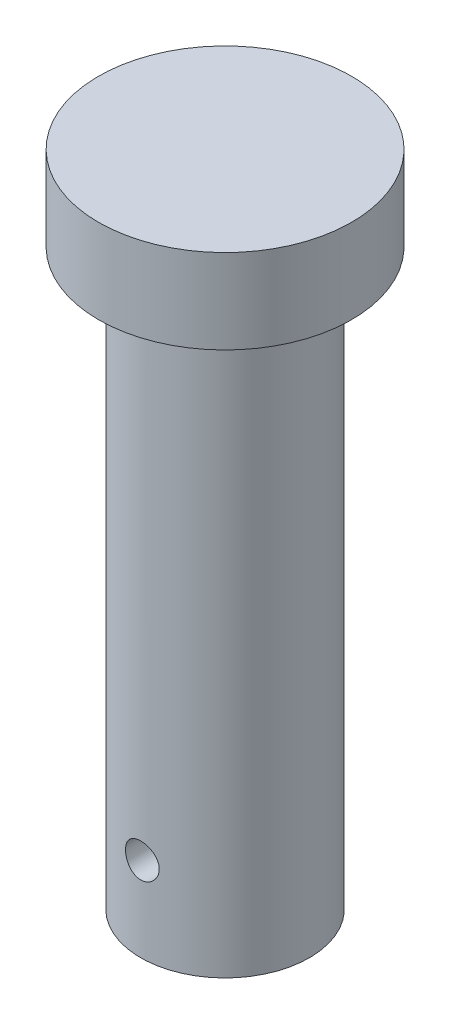
ISO-10303-21;
HEADER;
FILE_DESCRIPTION(('STEP AP214'),'2;1');
FILE_NAME('part.step','',(''),(''),'','','');
FILE_SCHEMA(('AUTOMOTIVE_DESIGN { 1 0 10303 214 1 1 1 1 }'));
ENDSEC;
DATA;
#1=APPLICATION_CONTEXT('core data for automotive mechanical design processes');
#2=APPLICATION_PROTOCOL_DEFINITION('international standard','automotive_design',2000,#1);
#3=PRODUCT_CONTEXT('',#1,'mechanical');
#4=PRODUCT('Part','Part','',(#3));
#5=PRODUCT_RELATED_PRODUCT_CATEGORY('part','',(#4));
#6=PRODUCT_DEFINITION_FORMATION('','',#4);
#7=PRODUCT_DEFINITION_CONTEXT('part definition',#1,'design');
#8=PRODUCT_DEFINITION('design','',#6,#7);
#9=PRODUCT_DEFINITION_SHAPE('','',#8);
#10=(LENGTH_UNIT() NAMED_UNIT(*) SI_UNIT(.MILLI.,.METRE.));
#11=(NAMED_UNIT(*) PLANE_ANGLE_UNIT() SI_UNIT($,.RADIAN.));
#12=(NAMED_UNIT(*) SI_UNIT($,.STERADIAN.) SOLID_ANGLE_UNIT());
#13=UNCERTAINTY_MEASURE_WITH_UNIT(LENGTH_MEASURE(1.E-05),#10,'distance_accuracy_value','');
#14=(GEOMETRIC_REPRESENTATION_CONTEXT(3) GLOBAL_UNCERTAINTY_ASSIGNED_CONTEXT((#13)) GLOBAL_UNIT_ASSIGNED_CONTEXT((#10,
#11,#12)) REPRESENTATION_CONTEXT('',''));
#15=CARTESIAN_POINT('',(0.,0.,0.));
#16=DIRECTION('',(0.,0.,1.));
#17=DIRECTION('',(1.,0.,0.));
#18=AXIS2_PLACEMENT_3D('',#15,#16,#17);
#19=CARTESIAN_POINT('',(0.,-15.,0.));
#20=DIRECTION('',(0.,1.,0.));
#21=DIRECTION('',(0.,0.,1.));
#22=AXIS2_PLACEMENT_3D('',#19,#20,#21);
#23=CYLINDRICAL_SURFACE('',#22,22.5);
#24=CARTESIAN_POINT('',(0.,-15.,0.));
#25=DIRECTION('',(0.,1.,0.));
#26=DIRECTION('',(0.,0.,1.));
#27=AXIS2_PLACEMENT_3D('',#24,#25,#26);
#28=CIRCLE('',#27,22.5);
#29=CARTESIAN_POINT('',(0.,-15.,22.5));
#30=VERTEX_POINT('',#29);
#31=EDGE_CURVE('E49',#30,#30,#28,.T.);
#32=ORIENTED_EDGE('',*,*,#31,.T.);
#33=EDGE_LOOP('',(#32));
#34=FACE_BOUND('',#33,.T.);
#35=CARTESIAN_POINT('',(0.,0.,0.));
#36=DIRECTION('',(0.,1.,0.));
#37=DIRECTION('',(0.,0.,1.));
#38=AXIS2_PLACEMENT_3D('',#35,#36,#37);
#39=CIRCLE('',#38,22.5);
#40=CARTESIAN_POINT('',(0.,0.,22.5));
#41=VERTEX_POINT('',#40);
#42=EDGE_CURVE('E54',#41,#41,#39,.T.);
#43=ORIENTED_EDGE('',*,*,#42,.F.);
#44=EDGE_LOOP('',(#43));
#45=FACE_BOUND('',#44,.T.);
#46=ADVANCED_FACE('F37',(#34,#45),#23,.T.);
#47=CARTESIAN_POINT('',(0.,-15.,0.));
#48=DIRECTION('',(0.,1.,0.));
#49=DIRECTION('',(0.,0.,1.));
#50=AXIS2_PLACEMENT_3D('',#47,#48,#49);
#51=PLANE('',#50);
#52=CARTESIAN_POINT('',(0.,-15.,0.));
#53=DIRECTION('',(0.,-1.,0.));
#54=DIRECTION('',(0.,0.,-1.));
#55=AXIS2_PLACEMENT_3D('',#52,#53,#54);
#56=CIRCLE('',#55,15.);
#57=CARTESIAN_POINT('',(0.,-15.,-15.));
#58=VERTEX_POINT('',#57);
#59=EDGE_CURVE('E10',#58,#58,#56,.T.);
#60=ORIENTED_EDGE('',*,*,#59,.F.);
#61=EDGE_LOOP('',(#60));
#62=FACE_BOUND('',#61,.T.);
#63=ORIENTED_EDGE('',*,*,#31,.F.);
#64=EDGE_LOOP('',(#63));
#65=FACE_BOUND('',#64,.T.);
#66=ADVANCED_FACE('F85',(#62,#65),#51,.F.);
#67=CARTESIAN_POINT('',(0.,0.,0.));
#68=DIRECTION('',(0.,1.,0.));
#69=DIRECTION('',(0.,0.,1.));
#70=AXIS2_PLACEMENT_3D('',#67,#68,#69);
#71=PLANE('',#70);
#72=ORIENTED_EDGE('',*,*,#42,.T.);
#73=EDGE_LOOP('',(#72));
#74=FACE_BOUND('',#73,.T.);
#75=ADVANCED_FACE('F81',(#74),#71,.T.);
#76=CARTESIAN_POINT('',(0.,-117.,0.));
#77=DIRECTION('',(0.,1.,0.));
#78=DIRECTION('',(0.,0.,1.));
#79=AXIS2_PLACEMENT_3D('',#76,#77,#78);
#80=CYLINDRICAL_SURFACE('',#79,15.);
#81=CARTESIAN_POINT('',(0.,-105.,15.));
#82=CARTESIAN_POINT('',(-0.1667307203779,-104.999993866505,14.9999969274261));
#83=CARTESIAN_POINT('',(-0.333538980604567,-104.986053471097,14.9971915553469));
#84=CARTESIAN_POINT('',(-0.662440523067058,-104.930704499654,14.9862709686969));
#85=CARTESIAN_POINT('',(-0.824529952624069,-104.889274101595,14.9781515358056));
#86=CARTESIAN_POINT('',(-1.13919091578994,-104.780276179138,14.9575094783486));
#87=CARTESIAN_POINT('',(-1.2917714037994,-104.712733689466,14.9449910723015));
#88=CARTESIAN_POINT('',(-1.58342396659268,-104.553503257466,14.9169119410594));
#89=CARTESIAN_POINT('',(-1.72249684522744,-104.461816753178,14.9013513970712));
#90=CARTESIAN_POINT('',(-1.9850804319446,-104.255584517126,14.8686649598991));
#91=CARTESIAN_POINT('',(-2.10838185347558,-104.140774933826,14.8515223651304));
#92=CARTESIAN_POINT('',(-2.33411026982409,-103.892122750825,14.8177254135776));
#93=CARTESIAN_POINT('',(-2.43653563431128,-103.758278665995,14.8010710950127));
#94=CARTESIAN_POINT('',(-2.61849526004286,-103.473851420964,14.7699732543785));
#95=CARTESIAN_POINT('',(-2.6978128165976,-103.323127068611,14.7555512209484));
#96=CARTESIAN_POINT('',(-2.82991699974093,-103.010154542988,14.7307880417525));
#97=CARTESIAN_POINT('',(-2.88270624731171,-102.847907509961,14.7204464928588));
#98=CARTESIAN_POINT('',(-2.95957589965448,-102.518746908276,14.7051841575661));
#99=CARTESIAN_POINT('',(-2.98402349387633,-102.351922367573,14.7001941032156));
#100=CARTESIAN_POINT('',(-3.00465638317836,-102.016470535907,14.6959912518188));
#101=CARTESIAN_POINT('',(-3.0008445681405,-101.84784343104,14.6967778640352));
#102=CARTESIAN_POINT('',(-2.96536371930546,-101.516259635937,14.7039765344455));
#103=CARTESIAN_POINT('',(-2.93411562073172,-101.353255783118,14.7103035857629));
#104=CARTESIAN_POINT('',(-2.84531365386916,-101.034851770011,14.7277363848));
#105=CARTESIAN_POINT('',(-2.78775852930205,-100.879451973243,14.7388423607334));
#106=CARTESIAN_POINT('',(-2.64757435102416,-100.579454214889,14.7646685550122));
#107=CARTESIAN_POINT('',(-2.56477845369634,-100.434936361292,14.7794126944111));
#108=CARTESIAN_POINT('',(-2.37658072371803,-100.161687450082,14.8108385631919));
#109=CARTESIAN_POINT('',(-2.27117629307048,-100.032958209447,14.827520515151));
#110=CARTESIAN_POINT('',(-2.03849980368175,-99.7925117926292,14.8613106372439));
#111=CARTESIAN_POINT('',(-1.91086848363733,-99.6811422964226,14.8784210763271));
#112=CARTESIAN_POINT('',(-1.63855507218603,-99.4813384610963,14.9108654614323));
#113=CARTESIAN_POINT('',(-1.49387276213817,-99.3929044161193,14.9261993846692));
#114=CARTESIAN_POINT('',(-1.19117816063676,-99.2414174723221,14.9534007048266));
#115=CARTESIAN_POINT('',(-1.0331454587559,-99.1784043190664,14.9652626654482));
#116=CARTESIAN_POINT('',(-0.708446929345995,-99.0799185778843,14.9841422696357));
#117=CARTESIAN_POINT('',(-0.54178215021735,-99.0444426537791,14.9911605000159));
#118=CARTESIAN_POINT('',(-0.207538216881452,-99.0025306386172,14.999480156006));
#119=CARTESIAN_POINT('',(-0.0400209849767281,-98.9956187413792,15.0008752395741));
#120=CARTESIAN_POINT('',(0.293774802578144,-99.0097495768265,14.9980515579031));
#121=CARTESIAN_POINT('',(0.460053427331382,-99.0307907380578,14.9938331082434));
#122=CARTESIAN_POINT('',(0.785116979839625,-99.0998351206319,14.9803149602405));
#123=CARTESIAN_POINT('',(0.943955845019711,-99.1475942054937,14.9710612921262));
#124=CARTESIAN_POINT('',(1.251370882499,-99.2684519479674,14.948506561831));
#125=CARTESIAN_POINT('',(1.39994628491262,-99.3415525040305,14.9352051964268));
#126=CARTESIAN_POINT('',(1.68462352105865,-99.5120474719539,14.9057973459988));
#127=CARTESIAN_POINT('',(1.82055038025656,-99.6097283431168,14.8896585131116));
#128=CARTESIAN_POINT('',(2.07425405735762,-99.8262275736218,14.8564420448965));
#129=CARTESIAN_POINT('',(2.19202892679229,-99.9450481991996,14.8393643090516));
#130=CARTESIAN_POINT('',(2.40792177232253,-100.202620055673,14.8058791067089));
#131=CARTESIAN_POINT('',(2.50571310734597,-100.341647232664,14.7894858069991));
#132=CARTESIAN_POINT('',(2.67655626015362,-100.63443408407,14.7595257538858));
#133=CARTESIAN_POINT('',(2.74960906776871,-100.788193168721,14.7459588874003));
#134=CARTESIAN_POINT('',(2.86845552474588,-101.105304738449,14.7233022175315));
#135=CARTESIAN_POINT('',(2.91439049937316,-101.268602523631,14.7141892461656));
#136=CARTESIAN_POINT('',(2.97812595488159,-101.600800360473,14.7014231037608));
#137=CARTESIAN_POINT('',(2.99593010467534,-101.769699678628,14.6977692207333));
#138=CARTESIAN_POINT('',(3.00276273260241,-102.105026593633,14.6963744889414));
#139=CARTESIAN_POINT('',(2.99230736421269,-102.271443446781,14.698527575679));
#140=CARTESIAN_POINT('',(2.94405691230018,-102.600094949715,14.7082672045384));
#141=CARTESIAN_POINT('',(2.90626204838789,-102.762329633084,14.7158537030151));
#142=CARTESIAN_POINT('',(2.80463570549686,-103.077683133722,14.7355579265748));
#143=CARTESIAN_POINT('',(2.74086752015203,-103.230823081507,14.7476646305649));
#144=CARTESIAN_POINT('',(2.58916393380481,-103.524311162203,14.7750514492251));
#145=CARTESIAN_POINT('',(2.50122650632464,-103.664658221175,14.7903318299668));
#146=CARTESIAN_POINT('',(2.30191774435924,-103.931146716451,14.8226688156968));
#147=CARTESIAN_POINT('',(2.19017366170554,-104.057006295803,14.839751187291));
#148=CARTESIAN_POINT('',(1.94719310703942,-104.288358616588,14.8735824561586));
#149=CARTESIAN_POINT('',(1.81595216146001,-104.393846670952,14.8903312758955));
#150=CARTESIAN_POINT('',(1.53605288726474,-104.582503931839,14.9218149716391));
#151=CARTESIAN_POINT('',(1.38722665328951,-104.66542800984,14.9365269365774));
#152=CARTESIAN_POINT('',(1.07749908282219,-104.80495836779,14.96205375255));
#153=CARTESIAN_POINT('',(0.916608782589372,-104.861588368597,14.9728721141585));
#154=CARTESIAN_POINT('',(0.629464466771332,-104.935955844134,14.9872911778611));
#155=CARTESIAN_POINT('',(0.504844992041349,-104.959929581123,14.9920290947536));
#156=CARTESIAN_POINT('',(0.253498575630198,-104.991953737075,14.9983846241968));
#157=CARTESIAN_POINT('',(0.126771701245856,-105.000004663529,15.0000023361946));
#158=CARTESIAN_POINT('',(0.,-105.,15.));
#159=B_SPLINE_CURVE_WITH_KNOTS('',3,(#81,#82,#83,#84,#85,#86,#87,#88,#89,#90,#91,#92,#93,#94,
#95,#96,#97,#98,#99,#100,#101,#102,#103,#104,#105,#106,#107,#108,#109,#110,#111,#112,#113,#114,
#115,#116,#117,#118,#119,#120,#121,#122,#123,#124,#125,#126,#127,#128,#129,#130,#131,#132,#133,
#134,#135,#136,#137,#138,#139,#140,#141,#142,#143,#144,#145,#146,#147,#148,#149,#150,#151,#152,
#153,#154,#155,#156,#157,#158),.UNSPECIFIED.,.T.,.F.,(4,2,2,2,2,2,2,2,2,2,2,2,2,2,2,2,2,2,2,2,2,
2,2,2,2,2,2,2,2,2,2,2,2,2,2,2,2,2,4),(0.,0.499728391983775,0.999853952073971,1.49950120575103,
1.99911870669259,2.50479801033656,3.0105167902421,3.52083585017768,4.03110448095593,
4.53468555310762,5.03821512843675,5.53415181018835,6.0301121776119,6.52942470610779,
7.02879464249013,7.53714757474052,8.04550702619461,8.55465824562072,9.06374777094108,
9.56432207028796,10.064868229736,10.5609136185217,11.0569961764807,11.5591519810008,
12.0613616503779,12.5712188573768,13.081055661704,13.5882114309817,14.0953010499125,
14.5931916770311,15.0910783047783,15.5877588375933,16.084481027456,16.5896422871743,
17.0949196359879,17.6054849002691,18.1155886655256,18.4955632586968,18.8755257411299),.UNSPECIFIED.);
#160=CARTESIAN_POINT('',(0.,-105.,15.));
#161=VERTEX_POINT('',#160);
#162=EDGE_CURVE('E40',#161,#161,#159,.T.);
#163=ORIENTED_EDGE('',*,*,#162,.T.);
#164=EDGE_LOOP('',(#163));
#165=FACE_BOUND('',#164,.T.);
#166=CARTESIAN_POINT('',(3.,-102.,-14.6969384566991));
#167=CARTESIAN_POINT('',(2.99999383762582,-101.833306873527,-14.6969417707994));
#168=CARTESIAN_POINT('',(2.98605951515444,-101.66653613,-14.6998052480611));
#169=CARTESIAN_POINT('',(2.93073685074853,-101.337712484571,-14.7109329391462));
#170=CARTESIAN_POINT('',(2.88932654121148,-101.175663466092,-14.7192014743436));
#171=CARTESIAN_POINT('',(2.78038734785924,-100.861088089937,-14.7401662116556));
#172=CARTESIAN_POINT('',(2.71288444245787,-100.708552435402,-14.7528580086323));
#173=CARTESIAN_POINT('',(2.55374732301152,-100.416975465909,-14.7812339844198));
#174=CARTESIAN_POINT('',(2.46211445580346,-100.277933398386,-14.7969179962038));
#175=CARTESIAN_POINT('',(2.25593722696031,-100.015316988438,-14.8297589908276));
#176=CARTESIAN_POINT('',(2.14111696773996,-99.8919612363481,-14.8469321351174));
#177=CARTESIAN_POINT('',(1.89242036706393,-99.666127399263,-14.880674169078));
#178=CARTESIAN_POINT('',(1.75854269093395,-99.5636507777484,-14.8972430163249));
#179=CARTESIAN_POINT('',(1.47408406777277,-99.3816359471146,-14.9280838925269));
#180=CARTESIAN_POINT('',(1.32336770301663,-99.3023054585501,-14.9423346432465));
#181=CARTESIAN_POINT('',(1.01041245116181,-99.1701751888556,-14.9667521065089));
#182=CARTESIAN_POINT('',(0.84817464426166,-99.117372924297,-14.9769192013236));
#183=CARTESIAN_POINT('',(0.519050319835486,-99.0404784191411,-14.9919096206526));
#184=CARTESIAN_POINT('',(0.352253217644447,-99.016017067287,-14.9968015886438));
#185=CARTESIAN_POINT('',(0.0168557053126144,-98.9953471444851,-15.0009276355081));
#186=CARTESIAN_POINT('',(-0.151744529495524,-98.9991358510625,-15.0001622595828));
#187=CARTESIAN_POINT('',(-0.48342600223076,-99.0345785406467,-14.9931130460555));
#188=CARTESIAN_POINT('',(-0.646551642895403,-99.0658349315035,-14.9869079509751));
#189=CARTESIAN_POINT('',(-0.965194879740896,-99.1546950973767,-14.9697653147823));
#190=CARTESIAN_POINT('',(-1.12071217124138,-99.2122999265756,-14.9588275843212));
#191=CARTESIAN_POINT('',(-1.42085838960265,-99.3525901204418,-14.9333188805988));
#192=CARTESIAN_POINT('',(-1.56541252240169,-99.4354312533146,-14.9187254452567));
#193=CARTESIAN_POINT('',(-1.83871513757926,-99.6237272317098,-14.8875140842136));
#194=CARTESIAN_POINT('',(-1.96746179857499,-99.7291846793115,-14.8708959256567));
#195=CARTESIAN_POINT('',(-2.20785429316037,-99.9619008663254,-14.8371289309338));
#196=CARTESIAN_POINT('',(-2.31916294972089,-100.089507560189,-14.8199758937255));
#197=CARTESIAN_POINT('',(-2.51885547953042,-100.361749327352,-14.7873471479628));
#198=CARTESIAN_POINT('',(-2.60723891918325,-100.50638472265,-14.7718714711364));
#199=CARTESIAN_POINT('',(-2.75868844440564,-100.809062495465,-14.7443414241877));
#200=CARTESIAN_POINT('',(-2.82169994333313,-100.967132902919,-14.7322944469065));
#201=CARTESIAN_POINT('',(-2.92017102488275,-101.291913971172,-14.7130942896382));
#202=CARTESIAN_POINT('',(-2.95563419836993,-101.458623502857,-14.7059404718528));
#203=CARTESIAN_POINT('',(-2.99749801810816,-101.792894573997,-14.6974643780348));
#204=CARTESIAN_POINT('',(-3.00438557669374,-101.960392722931,-14.6960444117146));
#205=CARTESIAN_POINT('',(-2.99021288493222,-102.294144669599,-14.6989345706656));
#206=CARTESIAN_POINT('',(-2.96915421936733,-102.460398537357,-14.7032443710116));
#207=CARTESIAN_POINT('',(-2.90010662422247,-102.785305920877,-14.7170169748474));
#208=CARTESIAN_POINT('',(-2.8523778625179,-102.944017029107,-14.7264299704349));
#209=CARTESIAN_POINT('',(-2.73162310592555,-103.251189837086,-14.7493046805499));
#210=CARTESIAN_POINT('',(-2.65859502711953,-103.399650691307,-14.7627667285881));
#211=CARTESIAN_POINT('',(-2.4882124266468,-103.68423932985,-14.7924421788612));
#212=CARTESIAN_POINT('',(-2.39055323394826,-103.820181138902,-14.8086891559471));
#213=CARTESIAN_POINT('',(-2.17408671663814,-104.073924936003,-14.8420117147991));
#214=CARTESIAN_POINT('',(-2.05527721543362,-104.191725054748,-14.8590873817145));
#215=CARTESIAN_POINT('',(-1.79769682049368,-104.407687677557,-14.8924603760765));
#216=CARTESIAN_POINT('',(-1.6586474967889,-104.50552096395,-14.9087417312605));
#217=CARTESIAN_POINT('',(-1.36580368990427,-104.676437644499,-14.9384138288586));
#218=CARTESIAN_POINT('',(-1.21200982630053,-104.749522078034,-14.9518046926563));
#219=CARTESIAN_POINT('',(-0.894908042472047,-104.86838661524,-14.974118821832));
#220=CARTESIAN_POINT('',(-0.731660020434244,-104.914321554679,-14.9830673742781));
#221=CARTESIAN_POINT('',(-0.399568364039744,-104.978073742992,-14.9955970781298));
#222=CARTESIAN_POINT('',(-0.230725406133644,-104.995894378427,-14.9991788759955));
#223=CARTESIAN_POINT('',(0.104618681710854,-105.002780942889,-15.0005562136234));
#224=CARTESIAN_POINT('',(0.271109436424473,-104.992341841369,-14.9984513564799));
#225=CARTESIAN_POINT('',(0.599913093946942,-104.944098148357,-14.9889013068102));
#226=CARTESIAN_POINT('',(0.76222604926116,-104.906293900956,-14.9814561814329));
#227=CARTESIAN_POINT('',(1.07775824923519,-104.804613023725,-14.9620649509476));
#228=CARTESIAN_POINT('',(1.23099732972049,-104.740795865607,-14.9501291174284));
#229=CARTESIAN_POINT('',(1.5246636605582,-104.588963276007,-14.9230416637104));
#230=CARTESIAN_POINT('',(1.66508989730353,-104.500945932286,-14.9078897894096));
#231=CARTESIAN_POINT('',(1.93159167031774,-104.301541838816,-14.8757279747022));
#232=CARTESIAN_POINT('',(2.05739914834453,-104.189800990849,-14.858692002537));
#233=CARTESIAN_POINT('',(2.28864785327552,-103.946849279704,-14.8248366872359));
#234=CARTESIAN_POINT('',(2.39408424962674,-103.81563381156,-14.8080173963616));
#235=CARTESIAN_POINT('',(2.58267665834994,-103.535762049929,-14.7763002820179));
#236=CARTESIAN_POINT('',(2.66558044385427,-103.386933116636,-14.7614251071368));
#237=CARTESIAN_POINT('',(2.80507214779868,-103.07720168022,-14.7355571137924));
#238=CARTESIAN_POINT('',(2.86168393792249,-102.916310283938,-14.7245607757495));
#239=CARTESIAN_POINT('',(2.93600741957297,-102.629212633671,-14.7098904341353));
#240=CARTESIAN_POINT('',(2.95996169557105,-102.504643741458,-14.7050635474382));
#241=CARTESIAN_POINT('',(2.99196005387913,-102.253398136347,-14.6985863537725));
#242=CARTESIAN_POINT('',(3.00000468468793,-102.126721496267,-14.6969359372925));
#243=CARTESIAN_POINT('',(3.,-102.,-14.6969384566991));
#244=B_SPLINE_CURVE_WITH_KNOTS('',3,(#166,#167,#168,#169,#170,#171,#172,#173,#174,#175,#176,
#177,#178,#179,#180,#181,#182,#183,#184,#185,#186,#187,#188,#189,#190,#191,#192,#193,#194,#195,
#196,#197,#198,#199,#200,#201,#202,#203,#204,#205,#206,#207,#208,#209,#210,#211,#212,#213,#214,
#215,#216,#217,#218,#219,#220,#221,#222,#223,#224,#225,#226,#227,#228,#229,#230,#231,#232,#233,
#234,#235,#236,#237,#238,#239,#240,#241,#242,#243),.UNSPECIFIED.,.T.,.F.,(4,2,2,2,2,2,2,2,2,2,2,
2,2,2,2,2,2,2,2,2,2,2,2,2,2,2,2,2,2,2,2,2,2,2,2,2,2,2,4),(0.,0.499615391608283,
0.999630717852883,1.49914949382175,1.99864039457959,2.50446757645311,3.01033020106266,
3.52060201312351,4.03082604739679,4.53432746649241,5.03778036348745,5.53406368900612,
6.0303668722125,6.52979772666908,7.02928607310198,7.5374804028745,8.04568434368161,
8.55497589518331,9.06420105048074,9.56471273413781,10.0651960358526,10.5608802534996,
11.0566053106319,11.5587917932356,12.0610299861063,12.5709780520035,13.0809046989031,
13.5878944073595,14.0948230407488,14.5929305224406,15.0910317410027,15.5880005122636,
16.0850085640405,16.5900345607679,17.0951801666934,17.6057669573882,18.115889252706,
18.4957141091448,18.8755258705644),.UNSPECIFIED.);
#245=CARTESIAN_POINT('',(3.,-102.,-14.6969384566991));
#246=VERTEX_POINT('',#245);
#247=EDGE_CURVE('E60',#246,#246,#244,.T.);
#248=ORIENTED_EDGE('',*,*,#247,.T.);
#249=EDGE_LOOP('',(#248));
#250=FACE_BOUND('',#249,.T.);
#251=CARTESIAN_POINT('',(0.,-117.,0.));
#252=DIRECTION('',(0.,-1.,0.));
#253=DIRECTION('',(0.,0.,-1.));
#254=AXIS2_PLACEMENT_3D('',#251,#252,#253);
#255=CIRCLE('',#254,15.);
#256=CARTESIAN_POINT('',(0.,-117.,-15.));
#257=VERTEX_POINT('',#256);
#258=EDGE_CURVE('E57',#257,#257,#255,.T.);
#259=ORIENTED_EDGE('',*,*,#258,.F.);
#260=EDGE_LOOP('',(#259));
#261=FACE_BOUND('',#260,.T.);
#262=ORIENTED_EDGE('',*,*,#59,.T.);
#263=EDGE_LOOP('',(#262));
#264=FACE_BOUND('',#263,.T.);
#265=ADVANCED_FACE('F65',(#165,#250,#261,#264),#80,.T.);
#266=CARTESIAN_POINT('',(0.,-117.,0.));
#267=DIRECTION('',(0.,-1.,0.));
#268=DIRECTION('',(0.,0.,-1.));
#269=AXIS2_PLACEMENT_3D('',#266,#267,#268);
#270=PLANE('',#269);
#271=ORIENTED_EDGE('',*,*,#258,.T.);
#272=EDGE_LOOP('',(#271));
#273=FACE_BOUND('',#272,.T.);
#274=ADVANCED_FACE('F72',(#273),#270,.T.);
#275=CARTESIAN_POINT('',(0.,-102.,-51.));
#276=DIRECTION('',(0.,0.,1.));
#277=DIRECTION('',(1.,0.,0.));
#278=AXIS2_PLACEMENT_3D('',#275,#276,#277);
#279=CYLINDRICAL_SURFACE('',#278,3.);
#280=ORIENTED_EDGE('',*,*,#247,.F.);
#281=EDGE_LOOP('',(#280));
#282=FACE_BOUND('',#281,.T.);
#283=ORIENTED_EDGE('',*,*,#162,.F.);
#284=EDGE_LOOP('',(#283));
#285=FACE_BOUND('',#284,.T.);
#286=ADVANCED_FACE('F69',(#282,#285),#279,.F.);
#287=CLOSED_SHELL('',(#46,#66,#75,#265,#274,#286));
#288=MANIFOLD_SOLID_BREP('B2',#287);
#289=ADVANCED_BREP_SHAPE_REPRESENTATION('',(#18,#288),#14);
#290=SHAPE_DEFINITION_REPRESENTATION(#9,#289);
ENDSEC;
END-ISO-10303-21;
